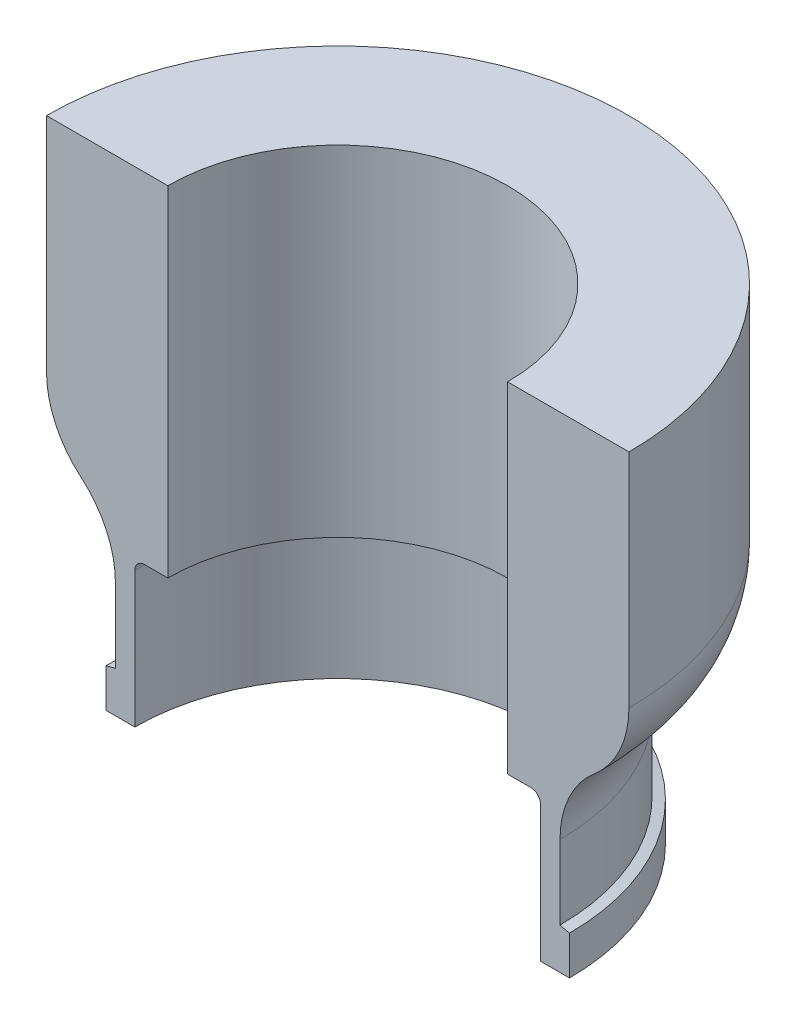
ISO-10303-21;
HEADER;
FILE_DESCRIPTION(('STEP AP214'),'2;1');
FILE_NAME('part.step','',(''),(''),'','','');
FILE_SCHEMA(('AUTOMOTIVE_DESIGN { 1 0 10303 214 1 1 1 1 }'));
ENDSEC;
DATA;
#1=APPLICATION_CONTEXT('core data for automotive mechanical design processes');
#2=APPLICATION_PROTOCOL_DEFINITION('international standard','automotive_design',2000,#1);
#3=PRODUCT_CONTEXT('',#1,'mechanical');
#4=PRODUCT('Part','Part','',(#3));
#5=PRODUCT_RELATED_PRODUCT_CATEGORY('part','',(#4));
#6=PRODUCT_DEFINITION_FORMATION('','',#4);
#7=PRODUCT_DEFINITION_CONTEXT('part definition',#1,'design');
#8=PRODUCT_DEFINITION('design','',#6,#7);
#9=PRODUCT_DEFINITION_SHAPE('','',#8);
#10=(LENGTH_UNIT() NAMED_UNIT(*) SI_UNIT(.MILLI.,.METRE.));
#11=(NAMED_UNIT(*) PLANE_ANGLE_UNIT() SI_UNIT($,.RADIAN.));
#12=(NAMED_UNIT(*) SI_UNIT($,.STERADIAN.) SOLID_ANGLE_UNIT());
#13=UNCERTAINTY_MEASURE_WITH_UNIT(LENGTH_MEASURE(1.E-05),#10,'distance_accuracy_value','');
#14=(GEOMETRIC_REPRESENTATION_CONTEXT(3) GLOBAL_UNCERTAINTY_ASSIGNED_CONTEXT((#13)) GLOBAL_UNIT_ASSIGNED_CONTEXT((#10,
#11,#12)) REPRESENTATION_CONTEXT('',''));
#15=CARTESIAN_POINT('',(0.,0.,0.));
#16=DIRECTION('',(0.,0.,1.));
#17=DIRECTION('',(1.,0.,0.));
#18=AXIS2_PLACEMENT_3D('',#15,#16,#17);
#19=CARTESIAN_POINT('',(0.,0.,0.));
#20=DIRECTION('',(0.,0.,1.));
#21=DIRECTION('',(1.,0.,0.));
#22=AXIS2_PLACEMENT_3D('',#19,#20,#21);
#23=PLANE('',#22);
#24=DIRECTION('',(-1.,0.,0.));
#25=VECTOR('',#24,1.);
#26=CARTESIAN_POINT('',(19.9,15.,0.));
#27=LINE('',#26,#25);
#28=CARTESIAN_POINT('',(-17.5,15.,0.));
#29=VERTEX_POINT('',#28);
#30=CARTESIAN_POINT('',(-19.9,15.,0.));
#31=VERTEX_POINT('',#30);
#32=EDGE_CURVE('E174',#29,#31,#27,.T.);
#33=ORIENTED_EDGE('',*,*,#32,.F.);
#34=DIRECTION('',(0.,1.,0.));
#35=VECTOR('',#34,1.);
#36=CARTESIAN_POINT('',(-17.5,-5.46497875116348,0.));
#37=LINE('',#36,#35);
#38=CARTESIAN_POINT('',(-17.5,49.9999999999736,0.));
#39=VERTEX_POINT('',#38);
#40=EDGE_CURVE('E163',#29,#39,#37,.T.);
#41=ORIENTED_EDGE('',*,*,#40,.T.);
#42=DIRECTION('',(-1.,0.,0.));
#43=VECTOR('',#42,1.);
#44=CARTESIAN_POINT('',(30.,49.9999999999736,0.));
#45=LINE('',#44,#43);
#46=CARTESIAN_POINT('',(-30.,49.9999999999736,0.));
#47=VERTEX_POINT('',#46);
#48=EDGE_CURVE('E46',#39,#47,#45,.T.);
#49=ORIENTED_EDGE('',*,*,#48,.T.);
#50=DIRECTION('',(0.,-1.,0.));
#51=VECTOR('',#50,1.);
#52=CARTESIAN_POINT('',(-30.,0.,0.));
#53=LINE('',#52,#51);
#54=CARTESIAN_POINT('',(-30.,27.1583373621054,0.));
#55=VERTEX_POINT('',#54);
#56=EDGE_CURVE('E144',#55,#47,#53,.F.);
#57=ORIENTED_EDGE('',*,*,#56,.F.);
#58=CARTESIAN_POINT('',(-20.,27.1583373621054,0.));
#59=DIRECTION('',(0.,0.,1.));
#60=DIRECTION('',(1.,0.,0.));
#61=AXIS2_PLACEMENT_3D('',#58,#59,#60);
#62=CIRCLE('',#61,10.);
#63=CARTESIAN_POINT('',(-26.4278760968653,19.4978929309156,0.));
#64=VERTEX_POINT('',#63);
#65=EDGE_CURVE('E240',#64,#55,#62,.F.);
#66=ORIENTED_EDGE('',*,*,#65,.F.);
#67=DIRECTION('',(0.766044443119003,-0.64278760968651,0.));
#68=VECTOR('',#67,1.);
#69=CARTESIAN_POINT('',(0.,-2.67772815476129,0.));
#70=LINE('',#69,#68);
#71=CARTESIAN_POINT('',(-26.4721239031347,19.5350212488365,0.));
#72=VERTEX_POINT('',#71);
#73=EDGE_CURVE('E243',#72,#64,#70,.T.);
#74=ORIENTED_EDGE('',*,*,#73,.F.);
#75=CARTESIAN_POINT('',(-32.9,11.8745768176467,0.));
#76=DIRECTION('',(0.,0.,1.));
#77=DIRECTION('',(1.,0.,0.));
#78=AXIS2_PLACEMENT_3D('',#75,#76,#77);
#79=CIRCLE('',#78,10.);
#80=CARTESIAN_POINT('',(-22.9,11.8745768176467,0.));
#81=VERTEX_POINT('',#80);
#82=EDGE_CURVE('E248',#81,#72,#79,.T.);
#83=ORIENTED_EDGE('',*,*,#82,.F.);
#84=DIRECTION('',(0.,-1.,0.));
#85=VECTOR('',#84,1.);
#86=CARTESIAN_POINT('',(-22.9,0.,0.));
#87=LINE('',#86,#85);
#88=CARTESIAN_POINT('',(-22.9,4.23666284308145,0.));
#89=VERTEX_POINT('',#88);
#90=EDGE_CURVE('E254',#89,#81,#87,.F.);
#91=ORIENTED_EDGE('',*,*,#90,.F.);
#92=DIRECTION('',(-0.971591837504105,-0.236662843081454,0.));
#93=VECTOR('',#92,1.);
#94=CARTESIAN_POINT('',(0.,9.81470384483328,0.));
#95=LINE('',#94,#93);
#96=CARTESIAN_POINT('',(-23.8715918375041,4.,0.));
#97=VERTEX_POINT('',#96);
#98=EDGE_CURVE('E236',#97,#89,#95,.F.);
#99=ORIENTED_EDGE('',*,*,#98,.F.);
#100=DIRECTION('',(0.,-1.,0.));
#101=VECTOR('',#100,1.);
#102=CARTESIAN_POINT('',(-23.8715918375041,0.,0.));
#103=LINE('',#102,#101);
#104=CARTESIAN_POINT('',(-23.8715918375041,0.,0.));
#105=VERTEX_POINT('',#104);
#106=EDGE_CURVE('E237',#105,#97,#103,.F.);
#107=ORIENTED_EDGE('',*,*,#106,.F.);
#108=DIRECTION('',(-1.,0.,0.));
#109=VECTOR('',#108,1.);
#110=CARTESIAN_POINT('',(20.9,0.,0.));
#111=LINE('',#110,#109);
#112=CARTESIAN_POINT('',(-20.9,0.,0.));
#113=VERTEX_POINT('',#112);
#114=EDGE_CURVE('E231',#113,#105,#111,.T.);
#115=ORIENTED_EDGE('',*,*,#114,.F.);
#116=DIRECTION('',(0.,-1.,0.));
#117=VECTOR('',#116,1.);
#118=CARTESIAN_POINT('',(-20.9,0.,0.));
#119=LINE('',#118,#117);
#120=CARTESIAN_POINT('',(-20.9,14.,0.));
#121=VERTEX_POINT('',#120);
#122=EDGE_CURVE('E226',#121,#113,#119,.T.);
#123=ORIENTED_EDGE('',*,*,#122,.F.);
#124=CARTESIAN_POINT('',(-19.9,14.,0.));
#125=DIRECTION('',(0.,0.,1.));
#126=DIRECTION('',(1.,0.,0.));
#127=AXIS2_PLACEMENT_3D('',#124,#125,#126);
#128=CIRCLE('',#127,1.);
#129=EDGE_CURVE('E219',#31,#121,#128,.T.);
#130=ORIENTED_EDGE('',*,*,#129,.F.);
#131=EDGE_LOOP('',(#33,#41,#49,#57,#66,#74,#83,#91,#99,#107,#115,#123,#130));
#132=FACE_BOUND('',#131,.T.);
#133=ADVANCED_FACE('F42',(#132),#23,.T.);
#134=DIRECTION('',(0.,1.,0.));
#135=VECTOR('',#134,1.);
#136=CARTESIAN_POINT('',(17.5,-5.46497875116348,0.));
#137=LINE('',#136,#135);
#138=CARTESIAN_POINT('',(17.5,15.,0.));
#139=VERTEX_POINT('',#138);
#140=CARTESIAN_POINT('',(17.5,49.9999999999736,0.));
#141=VERTEX_POINT('',#140);
#142=EDGE_CURVE('E179',#139,#141,#137,.T.);
#143=ORIENTED_EDGE('',*,*,#142,.F.);
#144=CARTESIAN_POINT('',(19.9,15.,0.));
#145=VERTEX_POINT('',#144);
#146=EDGE_CURVE('E158',#145,#139,#27,.T.);
#147=ORIENTED_EDGE('',*,*,#146,.F.);
#148=CARTESIAN_POINT('',(19.9,14.,0.));
#149=DIRECTION('',(0.,0.,1.));
#150=DIRECTION('',(1.,0.,0.));
#151=AXIS2_PLACEMENT_3D('',#148,#149,#150);
#152=CIRCLE('',#151,1.);
#153=CARTESIAN_POINT('',(20.9,14.,0.));
#154=VERTEX_POINT('',#153);
#155=EDGE_CURVE('E215',#154,#145,#152,.T.);
#156=ORIENTED_EDGE('',*,*,#155,.F.);
#157=DIRECTION('',(0.,-1.,0.));
#158=VECTOR('',#157,1.);
#159=CARTESIAN_POINT('',(20.9,0.,0.));
#160=LINE('',#159,#158);
#161=CARTESIAN_POINT('',(20.9,0.,0.));
#162=VERTEX_POINT('',#161);
#163=EDGE_CURVE('E222',#162,#154,#160,.F.);
#164=ORIENTED_EDGE('',*,*,#163,.F.);
#165=CARTESIAN_POINT('',(23.8715918375041,0.,0.));
#166=VERTEX_POINT('',#165);
#167=EDGE_CURVE('E225',#166,#162,#111,.T.);
#168=ORIENTED_EDGE('',*,*,#167,.F.);
#169=DIRECTION('',(0.,-1.,0.));
#170=VECTOR('',#169,1.);
#171=CARTESIAN_POINT('',(23.8715918375041,0.,0.));
#172=LINE('',#171,#170);
#173=CARTESIAN_POINT('',(23.8715918375041,4.,0.));
#174=VERTEX_POINT('',#173);
#175=EDGE_CURVE('E232',#174,#166,#172,.T.);
#176=ORIENTED_EDGE('',*,*,#175,.F.);
#177=DIRECTION('',(-0.971591837504105,0.236662843081454,0.));
#178=VECTOR('',#177,1.);
#179=CARTESIAN_POINT('',(0.,9.81470384483328,0.));
#180=LINE('',#179,#178);
#181=CARTESIAN_POINT('',(22.9,4.23666284308145,0.));
#182=VERTEX_POINT('',#181);
#183=EDGE_CURVE('E258',#182,#174,#180,.F.);
#184=ORIENTED_EDGE('',*,*,#183,.F.);
#185=DIRECTION('',(0.,-1.,0.));
#186=VECTOR('',#185,1.);
#187=CARTESIAN_POINT('',(22.9,0.,0.));
#188=LINE('',#187,#186);
#189=CARTESIAN_POINT('',(22.9,11.8745768176467,0.));
#190=VERTEX_POINT('',#189);
#191=EDGE_CURVE('E253',#190,#182,#188,.T.);
#192=ORIENTED_EDGE('',*,*,#191,.F.);
#193=CARTESIAN_POINT('',(32.9,11.8745768176467,0.));
#194=DIRECTION('',(0.,0.,1.));
#195=DIRECTION('',(1.,0.,0.));
#196=AXIS2_PLACEMENT_3D('',#193,#194,#195);
#197=CIRCLE('',#196,10.);
#198=CARTESIAN_POINT('',(26.4721239031347,19.5350212488365,0.));
#199=VERTEX_POINT('',#198);
#200=EDGE_CURVE('E252',#199,#190,#197,.T.);
#201=ORIENTED_EDGE('',*,*,#200,.F.);
#202=DIRECTION('',(0.766044443119003,0.64278760968651,0.));
#203=VECTOR('',#202,1.);
#204=CARTESIAN_POINT('',(0.,-2.67772815476129,0.));
#205=LINE('',#204,#203);
#206=CARTESIAN_POINT('',(26.4278760968653,19.4978929309156,0.));
#207=VERTEX_POINT('',#206);
#208=EDGE_CURVE('E247',#207,#199,#205,.T.);
#209=ORIENTED_EDGE('',*,*,#208,.F.);
#210=CARTESIAN_POINT('',(20.,27.1583373621054,0.));
#211=DIRECTION('',(0.,0.,1.));
#212=DIRECTION('',(1.,0.,0.));
#213=AXIS2_PLACEMENT_3D('',#210,#211,#212);
#214=CIRCLE('',#213,10.);
#215=CARTESIAN_POINT('',(30.,27.1583373621054,0.));
#216=VERTEX_POINT('',#215);
#217=EDGE_CURVE('E156',#216,#207,#214,.F.);
#218=ORIENTED_EDGE('',*,*,#217,.F.);
#219=DIRECTION('',(0.,-1.,0.));
#220=VECTOR('',#219,1.);
#221=CARTESIAN_POINT('',(30.,0.,0.));
#222=LINE('',#221,#220);
#223=CARTESIAN_POINT('',(30.,49.9999999999736,0.));
#224=VERTEX_POINT('',#223);
#225=EDGE_CURVE('E141',#224,#216,#222,.T.);
#226=ORIENTED_EDGE('',*,*,#225,.F.);
#227=EDGE_CURVE('E153',#224,#141,#45,.T.);
#228=ORIENTED_EDGE('',*,*,#227,.T.);
#229=EDGE_LOOP('',(#143,#147,#156,#164,#168,#176,#184,#192,#201,#209,#218,#226,#228));
#230=FACE_BOUND('',#229,.T.);
#231=ADVANCED_FACE('F152',(#230),#23,.T.);
#232=CARTESIAN_POINT('',(0.,49.9999999999736,0.));
#233=DIRECTION('',(0.,-1.,0.));
#234=DIRECTION('',(0.,0.,-1.));
#235=AXIS2_PLACEMENT_3D('',#232,#233,#234);
#236=PLANE('',#235);
#237=CARTESIAN_POINT('',(0.,49.9999999999736,0.));
#238=DIRECTION('',(0.,-1.,0.));
#239=DIRECTION('',(0.,0.,-1.));
#240=AXIS2_PLACEMENT_3D('',#237,#238,#239);
#241=CIRCLE('',#240,17.5);
#242=EDGE_CURVE('E52',#39,#141,#241,.T.);
#243=ORIENTED_EDGE('',*,*,#242,.T.);
#244=ORIENTED_EDGE('',*,*,#227,.F.);
#245=CARTESIAN_POINT('',(0.,49.9999999999736,0.));
#246=DIRECTION('',(0.,-1.,0.));
#247=DIRECTION('',(0.,0.,-1.));
#248=AXIS2_PLACEMENT_3D('',#245,#246,#247);
#249=CIRCLE('',#248,30.);
#250=EDGE_CURVE('E12',#47,#224,#249,.T.);
#251=ORIENTED_EDGE('',*,*,#250,.F.);
#252=ORIENTED_EDGE('',*,*,#48,.F.);
#253=EDGE_LOOP('',(#243,#244,#251,#252));
#254=FACE_BOUND('',#253,.T.);
#255=ADVANCED_FACE('F160',(#254),#236,.F.);
#256=CARTESIAN_POINT('',(0.,-5.46497875116348,0.));
#257=DIRECTION('',(0.,1.,0.));
#258=DIRECTION('',(0.,0.,1.));
#259=AXIS2_PLACEMENT_3D('',#256,#257,#258);
#260=CYLINDRICAL_SURFACE('',#259,17.5);
#261=ORIENTED_EDGE('',*,*,#242,.F.);
#262=ORIENTED_EDGE('',*,*,#40,.F.);
#263=CARTESIAN_POINT('',(0.,15.,0.));
#264=DIRECTION('',(0.,-1.,0.));
#265=DIRECTION('',(0.,0.,-1.));
#266=AXIS2_PLACEMENT_3D('',#263,#264,#265);
#267=CIRCLE('',#266,17.5);
#268=EDGE_CURVE('E177',#139,#29,#267,.F.);
#269=ORIENTED_EDGE('',*,*,#268,.F.);
#270=ORIENTED_EDGE('',*,*,#142,.T.);
#271=EDGE_LOOP('',(#261,#262,#269,#270));
#272=FACE_BOUND('',#271,.T.);
#273=ADVANCED_FACE('F176',(#272),#260,.F.);
#274=CARTESIAN_POINT('',(0.,0.,0.));
#275=DIRECTION('',(0.,-1.,0.));
#276=DIRECTION('',(0.,0.,-1.));
#277=AXIS2_PLACEMENT_3D('',#274,#275,#276);
#278=CYLINDRICAL_SURFACE('',#277,20.9);
#279=CARTESIAN_POINT('',(0.,14.,0.));
#280=DIRECTION('',(0.,-1.,0.));
#281=DIRECTION('',(0.,0.,-1.));
#282=AXIS2_PLACEMENT_3D('',#279,#280,#281);
#283=CIRCLE('',#282,20.9);
#284=EDGE_CURVE('E183',#121,#154,#283,.T.);
#285=ORIENTED_EDGE('',*,*,#284,.F.);
#286=ORIENTED_EDGE('',*,*,#122,.T.);
#287=CARTESIAN_POINT('',(0.,0.,0.));
#288=DIRECTION('',(0.,-1.,0.));
#289=DIRECTION('',(0.,0.,-1.));
#290=AXIS2_PLACEMENT_3D('',#287,#288,#289);
#291=CIRCLE('',#290,20.9);
#292=EDGE_CURVE('E60',#113,#162,#291,.T.);
#293=ORIENTED_EDGE('',*,*,#292,.T.);
#294=ORIENTED_EDGE('',*,*,#163,.T.);
#295=EDGE_LOOP('',(#285,#286,#293,#294));
#296=FACE_BOUND('',#295,.T.);
#297=ADVANCED_FACE('F314',(#296),#278,.F.);
#298=CARTESIAN_POINT('',(19.9,15.,0.));
#299=DIRECTION('',(0.,-1.,0.));
#300=DIRECTION('',(0.,0.,-1.));
#301=AXIS2_PLACEMENT_3D('',#298,#299,#300);
#302=PLANE('',#301);
#303=CARTESIAN_POINT('',(0.,15.,0.));
#304=DIRECTION('',(0.,-1.,0.));
#305=DIRECTION('',(0.,0.,-1.));
#306=AXIS2_PLACEMENT_3D('',#303,#304,#305);
#307=CIRCLE('',#306,19.9);
#308=EDGE_CURVE('E189',#31,#145,#307,.T.);
#309=ORIENTED_EDGE('',*,*,#308,.T.);
#310=ORIENTED_EDGE('',*,*,#146,.T.);
#311=ORIENTED_EDGE('',*,*,#268,.T.);
#312=ORIENTED_EDGE('',*,*,#32,.T.);
#313=EDGE_LOOP('',(#309,#310,#311,#312));
#314=FACE_BOUND('',#313,.T.);
#315=ADVANCED_FACE('F309',(#314),#302,.T.);
#316=CARTESIAN_POINT('',(0.,14.,0.));
#317=DIRECTION('',(0.,-1.,0.));
#318=DIRECTION('',(0.,0.,-1.));
#319=AXIS2_PLACEMENT_3D('',#316,#317,#318);
#320=TOROIDAL_SURFACE('',#319,19.9,1.);
#321=ORIENTED_EDGE('',*,*,#308,.F.);
#322=ORIENTED_EDGE('',*,*,#129,.T.);
#323=ORIENTED_EDGE('',*,*,#284,.T.);
#324=ORIENTED_EDGE('',*,*,#155,.T.);
#325=EDGE_LOOP('',(#321,#322,#323,#324));
#326=FACE_BOUND('',#325,.T.);
#327=ADVANCED_FACE('F312',(#326),#320,.F.);
#328=CARTESIAN_POINT('',(20.9,0.,0.));
#329=DIRECTION('',(0.,-1.,0.));
#330=DIRECTION('',(0.,0.,-1.));
#331=AXIS2_PLACEMENT_3D('',#328,#329,#330);
#332=PLANE('',#331);
#333=CARTESIAN_POINT('',(0.,0.,0.));
#334=DIRECTION('',(0.,-1.,0.));
#335=DIRECTION('',(0.,0.,-1.));
#336=AXIS2_PLACEMENT_3D('',#333,#334,#335);
#337=CIRCLE('',#336,23.8715918375041);
#338=EDGE_CURVE('E210',#105,#166,#337,.T.);
#339=ORIENTED_EDGE('',*,*,#338,.T.);
#340=ORIENTED_EDGE('',*,*,#167,.T.);
#341=ORIENTED_EDGE('',*,*,#292,.F.);
#342=ORIENTED_EDGE('',*,*,#114,.T.);
#343=EDGE_LOOP('',(#339,#340,#341,#342));
#344=FACE_BOUND('',#343,.T.);
#345=ADVANCED_FACE('F305',(#344),#332,.T.);
#346=CARTESIAN_POINT('',(0.,0.,0.));
#347=DIRECTION('',(0.,-1.,0.));
#348=DIRECTION('',(0.,0.,-1.));
#349=AXIS2_PLACEMENT_3D('',#346,#347,#348);
#350=CYLINDRICAL_SURFACE('',#349,23.8715918375041);
#351=ORIENTED_EDGE('',*,*,#338,.F.);
#352=ORIENTED_EDGE('',*,*,#106,.T.);
#353=CARTESIAN_POINT('',(0.,4.,0.));
#354=DIRECTION('',(0.,-1.,0.));
#355=DIRECTION('',(0.,0.,-1.));
#356=AXIS2_PLACEMENT_3D('',#353,#354,#355);
#357=CIRCLE('',#356,23.8715918375041);
#358=EDGE_CURVE('E207',#97,#174,#357,.T.);
#359=ORIENTED_EDGE('',*,*,#358,.T.);
#360=ORIENTED_EDGE('',*,*,#175,.T.);
#361=EDGE_LOOP('',(#351,#352,#359,#360));
#362=FACE_BOUND('',#361,.T.);
#363=ADVANCED_FACE('F303',(#362),#350,.T.);
#364=CARTESIAN_POINT('',(0.,4.,0.));
#365=DIRECTION('',(0.,-1.,0.));
#366=DIRECTION('',(0.,0.,-1.));
#367=AXIS2_PLACEMENT_3D('',#364,#365,#366);
#368=CONICAL_SURFACE('',#367,23.8715918375041,1.33186665186768);
#369=ORIENTED_EDGE('',*,*,#358,.F.);
#370=ORIENTED_EDGE('',*,*,#98,.T.);
#371=CARTESIAN_POINT('',(0.,4.23666284308145,0.));
#372=DIRECTION('',(0.,-1.,0.));
#373=DIRECTION('',(0.,0.,-1.));
#374=AXIS2_PLACEMENT_3D('',#371,#372,#373);
#375=CIRCLE('',#374,22.9);
#376=EDGE_CURVE('E204',#89,#182,#375,.T.);
#377=ORIENTED_EDGE('',*,*,#376,.T.);
#378=ORIENTED_EDGE('',*,*,#183,.T.);
#379=EDGE_LOOP('',(#369,#370,#377,#378));
#380=FACE_BOUND('',#379,.T.);
#381=ADVANCED_FACE('F299',(#380),#368,.T.);
#382=CARTESIAN_POINT('',(0.,0.,0.));
#383=DIRECTION('',(0.,-1.,0.));
#384=DIRECTION('',(0.,0.,-1.));
#385=AXIS2_PLACEMENT_3D('',#382,#383,#384);
#386=CYLINDRICAL_SURFACE('',#385,22.9);
#387=ORIENTED_EDGE('',*,*,#376,.F.);
#388=ORIENTED_EDGE('',*,*,#90,.T.);
#389=CARTESIAN_POINT('',(0.,11.8745768176467,0.));
#390=DIRECTION('',(0.,-1.,0.));
#391=DIRECTION('',(0.,0.,-1.));
#392=AXIS2_PLACEMENT_3D('',#389,#390,#391);
#393=CIRCLE('',#392,22.9);
#394=EDGE_CURVE('E201',#81,#190,#393,.T.);
#395=ORIENTED_EDGE('',*,*,#394,.T.);
#396=ORIENTED_EDGE('',*,*,#191,.T.);
#397=EDGE_LOOP('',(#387,#388,#395,#396));
#398=FACE_BOUND('',#397,.T.);
#399=ADVANCED_FACE('F294',(#398),#386,.T.);
#400=CARTESIAN_POINT('',(0.,11.8745768176467,0.));
#401=DIRECTION('',(0.,-1.,0.));
#402=DIRECTION('',(0.,0.,-1.));
#403=AXIS2_PLACEMENT_3D('',#400,#401,#402);
#404=TOROIDAL_SURFACE('',#403,32.9,10.);
#405=ORIENTED_EDGE('',*,*,#394,.F.);
#406=ORIENTED_EDGE('',*,*,#82,.T.);
#407=CARTESIAN_POINT('',(0.,19.5350212488365,0.));
#408=DIRECTION('',(0.,-1.,0.));
#409=DIRECTION('',(0.,0.,-1.));
#410=AXIS2_PLACEMENT_3D('',#407,#408,#409);
#411=CIRCLE('',#410,26.4721239031347);
#412=EDGE_CURVE('E198',#72,#199,#411,.T.);
#413=ORIENTED_EDGE('',*,*,#412,.T.);
#414=ORIENTED_EDGE('',*,*,#200,.T.);
#415=EDGE_LOOP('',(#405,#406,#413,#414));
#416=FACE_BOUND('',#415,.T.);
#417=ADVANCED_FACE('F291',(#416),#404,.F.);
#418=CARTESIAN_POINT('',(0.,0.,0.));
#419=DIRECTION('',(0.,-1.,0.));
#420=DIRECTION('',(0.,0.,-1.));
#421=AXIS2_PLACEMENT_3D('',#418,#419,#420);
#422=CYLINDRICAL_SURFACE('',#421,30.);
#423=CARTESIAN_POINT('',(0.,27.1583373621054,0.));
#424=DIRECTION('',(0.,-1.,0.));
#425=DIRECTION('',(0.,0.,-1.));
#426=AXIS2_PLACEMENT_3D('',#423,#424,#425);
#427=CIRCLE('',#426,30.);
#428=EDGE_CURVE('E192',#55,#216,#427,.T.);
#429=ORIENTED_EDGE('',*,*,#428,.F.);
#430=ORIENTED_EDGE('',*,*,#56,.T.);
#431=ORIENTED_EDGE('',*,*,#250,.T.);
#432=ORIENTED_EDGE('',*,*,#225,.T.);
#433=EDGE_LOOP('',(#429,#430,#431,#432));
#434=FACE_BOUND('',#433,.T.);
#435=ADVANCED_FACE('F140',(#434),#422,.T.);
#436=CARTESIAN_POINT('',(0.,19.5350212488365,0.));
#437=DIRECTION('',(0.,1.,0.));
#438=DIRECTION('',(0.,0.,1.));
#439=AXIS2_PLACEMENT_3D('',#436,#437,#438);
#440=CONICAL_SURFACE('',#439,26.4721239031347,0.872664625997203);
#441=CARTESIAN_POINT('',(0.,19.4978929309156,0.));
#442=DIRECTION('',(0.,-1.,0.));
#443=DIRECTION('',(0.,0.,-1.));
#444=AXIS2_PLACEMENT_3D('',#441,#442,#443);
#445=CIRCLE('',#444,26.4278760968653);
#446=EDGE_CURVE('E195',#64,#207,#445,.T.);
#447=ORIENTED_EDGE('',*,*,#446,.T.);
#448=ORIENTED_EDGE('',*,*,#208,.T.);
#449=ORIENTED_EDGE('',*,*,#412,.F.);
#450=ORIENTED_EDGE('',*,*,#73,.T.);
#451=EDGE_LOOP('',(#447,#448,#449,#450));
#452=FACE_BOUND('',#451,.T.);
#453=ADVANCED_FACE('F288',(#452),#440,.F.);
#454=CARTESIAN_POINT('',(0.,27.1583373621054,0.));
#455=DIRECTION('',(0.,-1.,0.));
#456=DIRECTION('',(0.,0.,-1.));
#457=AXIS2_PLACEMENT_3D('',#454,#455,#456);
#458=TOROIDAL_SURFACE('',#457,20.,10.);
#459=ORIENTED_EDGE('',*,*,#446,.F.);
#460=ORIENTED_EDGE('',*,*,#65,.T.);
#461=ORIENTED_EDGE('',*,*,#428,.T.);
#462=ORIENTED_EDGE('',*,*,#217,.T.);
#463=EDGE_LOOP('',(#459,#460,#461,#462));
#464=FACE_BOUND('',#463,.T.);
#465=ADVANCED_FACE('F44',(#464),#458,.T.);
#466=CLOSED_SHELL('',(#133,#231,#255,#273,#297,#315,#327,#345,#363,#381,#399,#417,#435,#453,#465));
#467=MANIFOLD_SOLID_BREP('B2',#466);
#468=ADVANCED_BREP_SHAPE_REPRESENTATION('',(#18,#467),#14);
#469=SHAPE_DEFINITION_REPRESENTATION(#9,#468);
ENDSEC;
END-ISO-10303-21;
